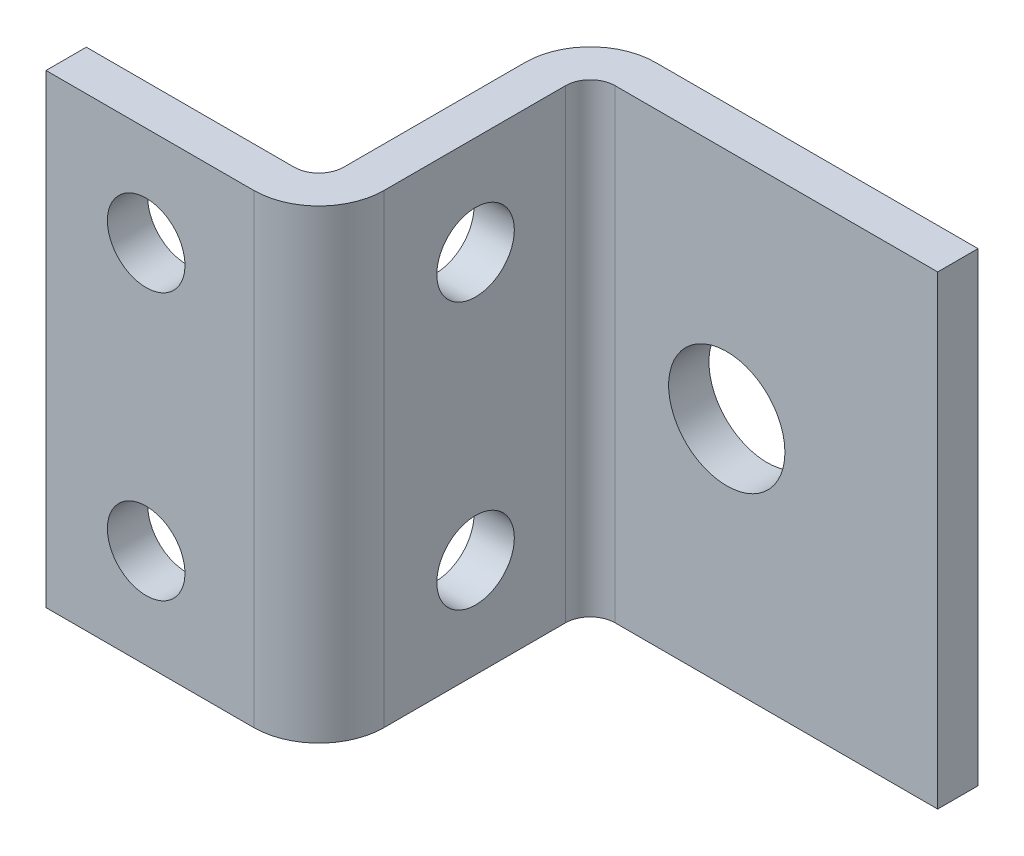
ISO-10303-21;
HEADER;
FILE_DESCRIPTION(('STEP AP214'),'2;1');
FILE_NAME('part.step','',(''),(''),'','','');
FILE_SCHEMA(('AUTOMOTIVE_DESIGN { 1 0 10303 214 1 1 1 1 }'));
ENDSEC;
DATA;
#1=APPLICATION_CONTEXT('core data for automotive mechanical design processes');
#2=APPLICATION_PROTOCOL_DEFINITION('international standard','automotive_design',2000,#1);
#3=PRODUCT_CONTEXT('',#1,'mechanical');
#4=PRODUCT('Part','Part','',(#3));
#5=PRODUCT_RELATED_PRODUCT_CATEGORY('part','',(#4));
#6=PRODUCT_DEFINITION_FORMATION('','',#4);
#7=PRODUCT_DEFINITION_CONTEXT('part definition',#1,'design');
#8=PRODUCT_DEFINITION('design','',#6,#7);
#9=PRODUCT_DEFINITION_SHAPE('','',#8);
#10=(LENGTH_UNIT() NAMED_UNIT(*) SI_UNIT(.MILLI.,.METRE.));
#11=(NAMED_UNIT(*) PLANE_ANGLE_UNIT() SI_UNIT($,.RADIAN.));
#12=(NAMED_UNIT(*) SI_UNIT($,.STERADIAN.) SOLID_ANGLE_UNIT());
#13=UNCERTAINTY_MEASURE_WITH_UNIT(LENGTH_MEASURE(1.E-05),#10,'distance_accuracy_value','');
#14=(GEOMETRIC_REPRESENTATION_CONTEXT(3) GLOBAL_UNCERTAINTY_ASSIGNED_CONTEXT((#13)) GLOBAL_UNIT_ASSIGNED_CONTEXT((#10,
#11,#12)) REPRESENTATION_CONTEXT('',''));
#15=CARTESIAN_POINT('',(0.,0.,0.));
#16=DIRECTION('',(0.,0.,1.));
#17=DIRECTION('',(1.,0.,0.));
#18=AXIS2_PLACEMENT_3D('',#15,#16,#17);
#19=CARTESIAN_POINT('',(-2.032,19.05,22.225));
#20=DIRECTION('',(0.,0.,-1.));
#21=DIRECTION('',(-1.,0.,0.));
#22=AXIS2_PLACEMENT_3D('',#19,#20,#21);
#23=PLANE('',#22);
#24=CARTESIAN_POINT('',(-10.8458,10.922,22.225));
#25=DIRECTION('',(0.,0.,-1.));
#26=DIRECTION('',(-1.,0.,0.));
#27=AXIS2_PLACEMENT_3D('',#24,#25,#26);
#28=CIRCLE('',#27,3.175);
#29=CARTESIAN_POINT('',(-14.0208,10.922,22.225));
#30=VERTEX_POINT('',#29);
#31=EDGE_CURVE('E157',#30,#30,#28,.F.);
#32=ORIENTED_EDGE('',*,*,#31,.T.);
#33=EDGE_LOOP('',(#32));
#34=FACE_BOUND('',#33,.T.);
#35=DIRECTION('',(1.,0.,0.));
#36=VECTOR('',#35,1.);
#37=CARTESIAN_POINT('',(-2.032,-19.05,22.225));
#38=LINE('',#37,#36);
#39=CARTESIAN_POINT('',(-19.05,-19.05,22.225));
#40=VERTEX_POINT('',#39);
#41=CARTESIAN_POINT('',(-2.032,-19.05,22.225));
#42=VERTEX_POINT('',#41);
#43=EDGE_CURVE('E172',#40,#42,#38,.T.);
#44=ORIENTED_EDGE('',*,*,#43,.F.);
#45=DIRECTION('',(0.,-1.,0.));
#46=VECTOR('',#45,1.);
#47=CARTESIAN_POINT('',(-19.05,19.05,22.225));
#48=LINE('',#47,#46);
#49=CARTESIAN_POINT('',(-19.05,19.05,22.225));
#50=VERTEX_POINT('',#49);
#51=EDGE_CURVE('E188',#50,#40,#48,.T.);
#52=ORIENTED_EDGE('',*,*,#51,.F.);
#53=DIRECTION('',(1.,0.,0.));
#54=VECTOR('',#53,1.);
#55=CARTESIAN_POINT('',(-2.032,19.05,22.225));
#56=LINE('',#55,#54);
#57=CARTESIAN_POINT('',(-2.032,19.05,22.225));
#58=VERTEX_POINT('',#57);
#59=EDGE_CURVE('E230',#50,#58,#56,.T.);
#60=ORIENTED_EDGE('',*,*,#59,.T.);
#61=DIRECTION('',(0.,-1.,0.));
#62=VECTOR('',#61,1.);
#63=CARTESIAN_POINT('',(-2.032,19.05,22.225));
#64=LINE('',#63,#62);
#65=EDGE_CURVE('E190',#58,#42,#64,.T.);
#66=ORIENTED_EDGE('',*,*,#65,.T.);
#67=EDGE_LOOP('',(#44,#52,#60,#66));
#68=FACE_BOUND('',#67,.T.);
#69=CARTESIAN_POINT('',(-10.8458,-10.922,22.225));
#70=DIRECTION('',(0.,0.,-1.));
#71=DIRECTION('',(-1.,0.,0.));
#72=AXIS2_PLACEMENT_3D('',#69,#70,#71);
#73=CIRCLE('',#72,3.175);
#74=CARTESIAN_POINT('',(-14.0208,-10.922,22.225));
#75=VERTEX_POINT('',#74);
#76=EDGE_CURVE('E255',#75,#75,#73,.F.);
#77=ORIENTED_EDGE('',*,*,#76,.T.);
#78=EDGE_LOOP('',(#77));
#79=FACE_BOUND('',#78,.T.);
#80=ADVANCED_FACE('F32',(#34,#68,#79),#23,.T.);
#81=CARTESIAN_POINT('',(-2.032,19.05,25.527));
#82=DIRECTION('',(0.,0.,-1.));
#83=DIRECTION('',(-1.,0.,0.));
#84=AXIS2_PLACEMENT_3D('',#81,#82,#83);
#85=PLANE('',#84);
#86=CARTESIAN_POINT('',(-10.8458,10.922,25.527));
#87=DIRECTION('',(0.,0.,-1.));
#88=DIRECTION('',(-1.,0.,0.));
#89=AXIS2_PLACEMENT_3D('',#86,#87,#88);
#90=CIRCLE('',#89,3.175);
#91=CARTESIAN_POINT('',(-14.0208,10.922,25.527));
#92=VERTEX_POINT('',#91);
#93=EDGE_CURVE('E259',#92,#92,#90,.T.);
#94=ORIENTED_EDGE('',*,*,#93,.T.);
#95=EDGE_LOOP('',(#94));
#96=FACE_BOUND('',#95,.T.);
#97=DIRECTION('',(1.,0.,0.));
#98=VECTOR('',#97,1.);
#99=CARTESIAN_POINT('',(-2.032,-19.05,25.527));
#100=LINE('',#99,#98);
#101=CARTESIAN_POINT('',(-19.05,-19.05,25.527));
#102=VERTEX_POINT('',#101);
#103=CARTESIAN_POINT('',(-2.032,-19.05,25.527));
#104=VERTEX_POINT('',#103);
#105=EDGE_CURVE('E178',#102,#104,#100,.T.);
#106=ORIENTED_EDGE('',*,*,#105,.T.);
#107=DIRECTION('',(0.,-1.,0.));
#108=VECTOR('',#107,1.);
#109=CARTESIAN_POINT('',(-2.032,19.05,25.527));
#110=LINE('',#109,#108);
#111=CARTESIAN_POINT('',(-2.032,19.05,25.527));
#112=VERTEX_POINT('',#111);
#113=EDGE_CURVE('E144',#112,#104,#110,.T.);
#114=ORIENTED_EDGE('',*,*,#113,.F.);
#115=DIRECTION('',(1.,0.,0.));
#116=VECTOR('',#115,1.);
#117=CARTESIAN_POINT('',(-2.032,19.05,25.527));
#118=LINE('',#117,#116);
#119=CARTESIAN_POINT('',(-19.05,19.05,25.527));
#120=VERTEX_POINT('',#119);
#121=EDGE_CURVE('E135',#120,#112,#118,.T.);
#122=ORIENTED_EDGE('',*,*,#121,.F.);
#123=DIRECTION('',(0.,-1.,0.));
#124=VECTOR('',#123,1.);
#125=CARTESIAN_POINT('',(-19.05,19.05,25.527));
#126=LINE('',#125,#124);
#127=EDGE_CURVE('E186',#120,#102,#126,.T.);
#128=ORIENTED_EDGE('',*,*,#127,.T.);
#129=EDGE_LOOP('',(#106,#114,#122,#128));
#130=FACE_BOUND('',#129,.T.);
#131=CARTESIAN_POINT('',(-10.8458,-10.922,25.527));
#132=DIRECTION('',(0.,0.,-1.));
#133=DIRECTION('',(-1.,0.,0.));
#134=AXIS2_PLACEMENT_3D('',#131,#132,#133);
#135=CIRCLE('',#134,3.175);
#136=CARTESIAN_POINT('',(-14.0208,-10.922,25.527));
#137=VERTEX_POINT('',#136);
#138=EDGE_CURVE('E253',#137,#137,#135,.T.);
#139=ORIENTED_EDGE('',*,*,#138,.T.);
#140=EDGE_LOOP('',(#139));
#141=FACE_BOUND('',#140,.T.);
#142=ADVANCED_FACE('F246',(#96,#130,#141),#85,.F.);
#143=CARTESIAN_POINT('',(5.334,19.05,3.302));
#144=DIRECTION('',(0.,0.,-1.));
#145=DIRECTION('',(-1.,0.,0.));
#146=AXIS2_PLACEMENT_3D('',#143,#144,#145);
#147=PLANE('',#146);
#148=CARTESIAN_POINT('',(14.478,0.,3.302));
#149=DIRECTION('',(0.,0.,1.));
#150=DIRECTION('',(1.,0.,0.));
#151=AXIS2_PLACEMENT_3D('',#148,#149,#150);
#152=CIRCLE('',#151,4.7625);
#153=CARTESIAN_POINT('',(19.2405,0.,3.302));
#154=VERTEX_POINT('',#153);
#155=EDGE_CURVE('E315',#154,#154,#152,.T.);
#156=ORIENTED_EDGE('',*,*,#155,.F.);
#157=EDGE_LOOP('',(#156));
#158=FACE_BOUND('',#157,.T.);
#159=DIRECTION('',(1.,0.,0.));
#160=VECTOR('',#159,1.);
#161=CARTESIAN_POINT('',(5.334,-19.05,3.302));
#162=LINE('',#161,#160);
#163=CARTESIAN_POINT('',(5.334,-19.05,3.302));
#164=VERTEX_POINT('',#163);
#165=CARTESIAN_POINT('',(31.75,-19.05,3.302));
#166=VERTEX_POINT('',#165);
#167=EDGE_CURVE('E153',#164,#166,#162,.T.);
#168=ORIENTED_EDGE('',*,*,#167,.T.);
#169=DIRECTION('',(0.,-1.,0.));
#170=VECTOR('',#169,1.);
#171=CARTESIAN_POINT('',(31.75,19.05,3.302));
#172=LINE('',#171,#170);
#173=CARTESIAN_POINT('',(31.75,19.05,3.302));
#174=VERTEX_POINT('',#173);
#175=EDGE_CURVE('E11',#174,#166,#172,.T.);
#176=ORIENTED_EDGE('',*,*,#175,.F.);
#177=DIRECTION('',(1.,0.,0.));
#178=VECTOR('',#177,1.);
#179=CARTESIAN_POINT('',(5.334,19.05,3.302));
#180=LINE('',#179,#178);
#181=CARTESIAN_POINT('',(5.334,19.05,3.302));
#182=VERTEX_POINT('',#181);
#183=EDGE_CURVE('E101',#182,#174,#180,.T.);
#184=ORIENTED_EDGE('',*,*,#183,.F.);
#185=DIRECTION('',(0.,-1.,0.));
#186=VECTOR('',#185,1.);
#187=CARTESIAN_POINT('',(5.334,19.05,3.302));
#188=LINE('',#187,#186);
#189=EDGE_CURVE('E149',#182,#164,#188,.T.);
#190=ORIENTED_EDGE('',*,*,#189,.T.);
#191=EDGE_LOOP('',(#168,#176,#184,#190));
#192=FACE_BOUND('',#191,.T.);
#193=ADVANCED_FACE('F34',(#158,#192),#147,.F.);
#194=CARTESIAN_POINT('',(31.75,19.05,0.));
#195=DIRECTION('',(1.,0.,0.));
#196=DIRECTION('',(0.,0.,-1.));
#197=AXIS2_PLACEMENT_3D('',#194,#195,#196);
#198=PLANE('',#197);
#199=DIRECTION('',(0.,0.,1.));
#200=VECTOR('',#199,1.);
#201=CARTESIAN_POINT('',(31.75,-19.05,0.));
#202=LINE('',#201,#200);
#203=CARTESIAN_POINT('',(31.75,-19.05,0.));
#204=VERTEX_POINT('',#203);
#205=EDGE_CURVE('E156',#204,#166,#202,.T.);
#206=ORIENTED_EDGE('',*,*,#205,.F.);
#207=DIRECTION('',(0.,-1.,0.));
#208=VECTOR('',#207,1.);
#209=CARTESIAN_POINT('',(31.75,19.05,0.));
#210=LINE('',#209,#208);
#211=CARTESIAN_POINT('',(31.75,19.05,0.));
#212=VERTEX_POINT('',#211);
#213=EDGE_CURVE('E41',#212,#204,#210,.T.);
#214=ORIENTED_EDGE('',*,*,#213,.F.);
#215=DIRECTION('',(0.,0.,1.));
#216=VECTOR('',#215,1.);
#217=CARTESIAN_POINT('',(31.75,19.05,0.));
#218=LINE('',#217,#216);
#219=EDGE_CURVE('E219',#212,#174,#218,.T.);
#220=ORIENTED_EDGE('',*,*,#219,.T.);
#221=ORIENTED_EDGE('',*,*,#175,.T.);
#222=EDGE_LOOP('',(#206,#214,#220,#221));
#223=FACE_BOUND('',#222,.T.);
#224=ADVANCED_FACE('F206',(#223),#198,.T.);
#225=CARTESIAN_POINT('',(5.334,19.05,0.));
#226=DIRECTION('',(0.,0.,-1.));
#227=DIRECTION('',(-1.,0.,0.));
#228=AXIS2_PLACEMENT_3D('',#225,#226,#227);
#229=PLANE('',#228);
#230=CARTESIAN_POINT('',(14.478,0.,0.));
#231=DIRECTION('',(0.,0.,1.));
#232=DIRECTION('',(1.,0.,0.));
#233=AXIS2_PLACEMENT_3D('',#230,#231,#232);
#234=CIRCLE('',#233,4.7625);
#235=CARTESIAN_POINT('',(19.2405,0.,0.));
#236=VERTEX_POINT('',#235);
#237=EDGE_CURVE('E450',#236,#236,#234,.T.);
#238=ORIENTED_EDGE('',*,*,#237,.T.);
#239=EDGE_LOOP('',(#238));
#240=FACE_BOUND('',#239,.T.);
#241=DIRECTION('',(1.,0.,0.));
#242=VECTOR('',#241,1.);
#243=CARTESIAN_POINT('',(5.334,-19.05,0.));
#244=LINE('',#243,#242);
#245=CARTESIAN_POINT('',(5.334,-19.05,0.));
#246=VERTEX_POINT('',#245);
#247=EDGE_CURVE('E160',#246,#204,#244,.T.);
#248=ORIENTED_EDGE('',*,*,#247,.F.);
#249=DIRECTION('',(0.,-1.,0.));
#250=VECTOR('',#249,1.);
#251=CARTESIAN_POINT('',(5.334,19.05,0.));
#252=LINE('',#251,#250);
#253=CARTESIAN_POINT('',(5.334,19.05,0.));
#254=VERTEX_POINT('',#253);
#255=EDGE_CURVE('E196',#254,#246,#252,.T.);
#256=ORIENTED_EDGE('',*,*,#255,.F.);
#257=DIRECTION('',(1.,0.,0.));
#258=VECTOR('',#257,1.);
#259=CARTESIAN_POINT('',(5.334,19.05,0.));
#260=LINE('',#259,#258);
#261=EDGE_CURVE('E203',#254,#212,#260,.T.);
#262=ORIENTED_EDGE('',*,*,#261,.T.);
#263=ORIENTED_EDGE('',*,*,#213,.T.);
#264=EDGE_LOOP('',(#248,#256,#262,#263));
#265=FACE_BOUND('',#264,.T.);
#266=ADVANCED_FACE('F201',(#240,#265),#229,.T.);
#267=CARTESIAN_POINT('',(5.334,19.05,5.334));
#268=DIRECTION('',(0.,-1.,0.));
#269=DIRECTION('',(0.,0.,-1.));
#270=AXIS2_PLACEMENT_3D('',#267,#268,#269);
#271=CYLINDRICAL_SURFACE('',#270,5.334);
#272=CARTESIAN_POINT('',(5.334,-19.05,5.334));
#273=DIRECTION('',(0.,-1.,0.));
#274=DIRECTION('',(0.,0.,-1.));
#275=AXIS2_PLACEMENT_3D('',#272,#273,#274);
#276=CIRCLE('',#275,5.334);
#277=CARTESIAN_POINT('',(0.,-19.05,5.334));
#278=VERTEX_POINT('',#277);
#279=EDGE_CURVE('E163',#278,#246,#276,.T.);
#280=ORIENTED_EDGE('',*,*,#279,.F.);
#281=DIRECTION('',(0.,-1.,0.));
#282=VECTOR('',#281,1.);
#283=CARTESIAN_POINT('',(0.,19.05,5.334));
#284=LINE('',#283,#282);
#285=CARTESIAN_POINT('',(0.,19.05,5.334));
#286=VERTEX_POINT('',#285);
#287=EDGE_CURVE('E194',#286,#278,#284,.T.);
#288=ORIENTED_EDGE('',*,*,#287,.F.);
#289=CARTESIAN_POINT('',(5.334,19.05,5.334));
#290=DIRECTION('',(0.,-1.,0.));
#291=DIRECTION('',(0.,0.,-1.));
#292=AXIS2_PLACEMENT_3D('',#289,#290,#291);
#293=CIRCLE('',#292,5.334);
#294=EDGE_CURVE('E216',#286,#254,#293,.T.);
#295=ORIENTED_EDGE('',*,*,#294,.T.);
#296=ORIENTED_EDGE('',*,*,#255,.T.);
#297=EDGE_LOOP('',(#280,#288,#295,#296));
#298=FACE_BOUND('',#297,.T.);
#299=ADVANCED_FACE('F213',(#298),#271,.T.);
#300=CARTESIAN_POINT('',(0.,19.05,20.193));
#301=DIRECTION('',(-1.,0.,0.));
#302=DIRECTION('',(0.,0.,1.));
#303=AXIS2_PLACEMENT_3D('',#300,#301,#302);
#304=PLANE('',#303);
#305=CARTESIAN_POINT('',(0.,-10.922,12.7));
#306=DIRECTION('',(-1.,0.,0.));
#307=DIRECTION('',(0.,0.,1.));
#308=AXIS2_PLACEMENT_3D('',#305,#306,#307);
#309=CIRCLE('',#308,3.175);
#310=CARTESIAN_POINT('',(0.,-10.922,15.875));
#311=VERTEX_POINT('',#310);
#312=EDGE_CURVE('E443',#311,#311,#309,.T.);
#313=ORIENTED_EDGE('',*,*,#312,.F.);
#314=EDGE_LOOP('',(#313));
#315=FACE_BOUND('',#314,.T.);
#316=CARTESIAN_POINT('',(0.,10.922,12.7));
#317=DIRECTION('',(-1.,0.,0.));
#318=DIRECTION('',(0.,0.,1.));
#319=AXIS2_PLACEMENT_3D('',#316,#317,#318);
#320=CIRCLE('',#319,3.175);
#321=CARTESIAN_POINT('',(0.,10.922,15.875));
#322=VERTEX_POINT('',#321);
#323=EDGE_CURVE('E256',#322,#322,#320,.T.);
#324=ORIENTED_EDGE('',*,*,#323,.F.);
#325=EDGE_LOOP('',(#324));
#326=FACE_BOUND('',#325,.T.);
#327=DIRECTION('',(0.,0.,-1.));
#328=VECTOR('',#327,1.);
#329=CARTESIAN_POINT('',(0.,-19.05,20.193));
#330=LINE('',#329,#328);
#331=CARTESIAN_POINT('',(0.,-19.05,20.193));
#332=VERTEX_POINT('',#331);
#333=EDGE_CURVE('E166',#332,#278,#330,.T.);
#334=ORIENTED_EDGE('',*,*,#333,.F.);
#335=DIRECTION('',(0.,-1.,0.));
#336=VECTOR('',#335,1.);
#337=CARTESIAN_POINT('',(0.,19.05,20.193));
#338=LINE('',#337,#336);
#339=CARTESIAN_POINT('',(0.,19.05,20.193));
#340=VERTEX_POINT('',#339);
#341=EDGE_CURVE('E192',#340,#332,#338,.T.);
#342=ORIENTED_EDGE('',*,*,#341,.F.);
#343=DIRECTION('',(0.,0.,-1.));
#344=VECTOR('',#343,1.);
#345=CARTESIAN_POINT('',(0.,19.05,20.193));
#346=LINE('',#345,#344);
#347=EDGE_CURVE('E221',#340,#286,#346,.T.);
#348=ORIENTED_EDGE('',*,*,#347,.T.);
#349=ORIENTED_EDGE('',*,*,#287,.T.);
#350=EDGE_LOOP('',(#334,#342,#348,#349));
#351=FACE_BOUND('',#350,.T.);
#352=ADVANCED_FACE('F296',(#315,#326,#351),#304,.T.);
#353=CARTESIAN_POINT('',(-2.032,19.05,20.193));
#354=DIRECTION('',(0.,-1.,0.));
#355=DIRECTION('',(0.,0.,-1.));
#356=AXIS2_PLACEMENT_3D('',#353,#354,#355);
#357=CYLINDRICAL_SURFACE('',#356,2.032);
#358=CARTESIAN_POINT('',(-2.032,-19.05,20.193));
#359=DIRECTION('',(0.,1.,0.));
#360=DIRECTION('',(0.,0.,-1.));
#361=AXIS2_PLACEMENT_3D('',#358,#359,#360);
#362=CIRCLE('',#361,2.032);
#363=EDGE_CURVE('E169',#42,#332,#362,.T.);
#364=ORIENTED_EDGE('',*,*,#363,.F.);
#365=ORIENTED_EDGE('',*,*,#65,.F.);
#366=CARTESIAN_POINT('',(-2.032,19.05,20.193));
#367=DIRECTION('',(0.,1.,0.));
#368=DIRECTION('',(0.,0.,-1.));
#369=AXIS2_PLACEMENT_3D('',#366,#367,#368);
#370=CIRCLE('',#369,2.032);
#371=EDGE_CURVE('E227',#58,#340,#370,.T.);
#372=ORIENTED_EDGE('',*,*,#371,.T.);
#373=ORIENTED_EDGE('',*,*,#341,.T.);
#374=EDGE_LOOP('',(#364,#365,#372,#373));
#375=FACE_BOUND('',#374,.T.);
#376=ADVANCED_FACE('F293',(#375),#357,.F.);
#377=CARTESIAN_POINT('',(-19.05,19.05,25.527));
#378=DIRECTION('',(-1.,0.,0.));
#379=DIRECTION('',(0.,0.,1.));
#380=AXIS2_PLACEMENT_3D('',#377,#378,#379);
#381=PLANE('',#380);
#382=DIRECTION('',(0.,0.,-1.));
#383=VECTOR('',#382,1.);
#384=CARTESIAN_POINT('',(-19.05,-19.05,25.527));
#385=LINE('',#384,#383);
#386=EDGE_CURVE('E175',#102,#40,#385,.T.);
#387=ORIENTED_EDGE('',*,*,#386,.F.);
#388=ORIENTED_EDGE('',*,*,#127,.F.);
#389=DIRECTION('',(0.,0.,-1.));
#390=VECTOR('',#389,1.);
#391=CARTESIAN_POINT('',(-19.05,19.05,25.527));
#392=LINE('',#391,#390);
#393=EDGE_CURVE('E233',#120,#50,#392,.T.);
#394=ORIENTED_EDGE('',*,*,#393,.T.);
#395=ORIENTED_EDGE('',*,*,#51,.T.);
#396=EDGE_LOOP('',(#387,#388,#394,#395));
#397=FACE_BOUND('',#396,.T.);
#398=ADVANCED_FACE('F237',(#397),#381,.T.);
#399=CARTESIAN_POINT('',(-2.032,19.05,20.193));
#400=DIRECTION('',(0.,-1.,0.));
#401=DIRECTION('',(0.,0.,-1.));
#402=AXIS2_PLACEMENT_3D('',#399,#400,#401);
#403=CYLINDRICAL_SURFACE('',#402,5.334);
#404=CARTESIAN_POINT('',(-2.032,-19.05,20.193));
#405=DIRECTION('',(0.,1.,0.));
#406=DIRECTION('',(1.,0.,0.));
#407=AXIS2_PLACEMENT_3D('',#404,#405,#406);
#408=CIRCLE('',#407,5.334);
#409=CARTESIAN_POINT('',(3.302,-19.05,20.193));
#410=VERTEX_POINT('',#409);
#411=EDGE_CURVE('E143',#104,#410,#408,.T.);
#412=ORIENTED_EDGE('',*,*,#411,.T.);
#413=DIRECTION('',(0.,-1.,0.));
#414=VECTOR('',#413,1.);
#415=CARTESIAN_POINT('',(3.302,19.05,20.193));
#416=LINE('',#415,#414);
#417=CARTESIAN_POINT('',(3.302,19.05,20.193));
#418=VERTEX_POINT('',#417);
#419=EDGE_CURVE('E140',#418,#410,#416,.T.);
#420=ORIENTED_EDGE('',*,*,#419,.F.);
#421=CARTESIAN_POINT('',(-2.032,19.05,20.193));
#422=DIRECTION('',(0.,1.,0.));
#423=DIRECTION('',(1.,0.,0.));
#424=AXIS2_PLACEMENT_3D('',#421,#422,#423);
#425=CIRCLE('',#424,5.334);
#426=EDGE_CURVE('E128',#112,#418,#425,.T.);
#427=ORIENTED_EDGE('',*,*,#426,.F.);
#428=ORIENTED_EDGE('',*,*,#113,.T.);
#429=EDGE_LOOP('',(#412,#420,#427,#428));
#430=FACE_BOUND('',#429,.T.);
#431=ADVANCED_FACE('F141',(#430),#403,.T.);
#432=CARTESIAN_POINT('',(3.302,19.05,20.193));
#433=DIRECTION('',(-1.,0.,0.));
#434=DIRECTION('',(0.,0.,1.));
#435=AXIS2_PLACEMENT_3D('',#432,#433,#434);
#436=PLANE('',#435);
#437=CARTESIAN_POINT('',(3.302,-10.922,12.7));
#438=DIRECTION('',(1.,0.,0.));
#439=DIRECTION('',(0.,0.,-1.));
#440=AXIS2_PLACEMENT_3D('',#437,#438,#439);
#441=CIRCLE('',#440,3.175);
#442=CARTESIAN_POINT('',(3.302,-10.922,9.525));
#443=VERTEX_POINT('',#442);
#444=EDGE_CURVE('E445',#443,#443,#441,.T.);
#445=ORIENTED_EDGE('',*,*,#444,.F.);
#446=EDGE_LOOP('',(#445));
#447=FACE_BOUND('',#446,.T.);
#448=CARTESIAN_POINT('',(3.302,10.922,12.7));
#449=DIRECTION('',(1.,0.,0.));
#450=DIRECTION('',(0.,0.,-1.));
#451=AXIS2_PLACEMENT_3D('',#448,#449,#450);
#452=CIRCLE('',#451,3.175);
#453=CARTESIAN_POINT('',(3.302,10.922,9.525));
#454=VERTEX_POINT('',#453);
#455=EDGE_CURVE('E262',#454,#454,#452,.T.);
#456=ORIENTED_EDGE('',*,*,#455,.F.);
#457=EDGE_LOOP('',(#456));
#458=FACE_BOUND('',#457,.T.);
#459=DIRECTION('',(0.,0.,-1.));
#460=VECTOR('',#459,1.);
#461=CARTESIAN_POINT('',(3.302,-19.05,20.193));
#462=LINE('',#461,#460);
#463=CARTESIAN_POINT('',(3.302,-19.05,5.334));
#464=VERTEX_POINT('',#463);
#465=EDGE_CURVE('E89',#410,#464,#462,.T.);
#466=ORIENTED_EDGE('',*,*,#465,.T.);
#467=DIRECTION('',(0.,-1.,0.));
#468=VECTOR('',#467,1.);
#469=CARTESIAN_POINT('',(3.302,19.05,5.334));
#470=LINE('',#469,#468);
#471=CARTESIAN_POINT('',(3.302,19.05,5.334));
#472=VERTEX_POINT('',#471);
#473=EDGE_CURVE('E145',#472,#464,#470,.T.);
#474=ORIENTED_EDGE('',*,*,#473,.F.);
#475=DIRECTION('',(0.,0.,-1.));
#476=VECTOR('',#475,1.);
#477=CARTESIAN_POINT('',(3.302,19.05,20.193));
#478=LINE('',#477,#476);
#479=EDGE_CURVE('E132',#418,#472,#478,.T.);
#480=ORIENTED_EDGE('',*,*,#479,.F.);
#481=ORIENTED_EDGE('',*,*,#419,.T.);
#482=EDGE_LOOP('',(#466,#474,#480,#481));
#483=FACE_BOUND('',#482,.T.);
#484=ADVANCED_FACE('F147',(#447,#458,#483),#436,.F.);
#485=CARTESIAN_POINT('',(5.334,19.05,5.334));
#486=DIRECTION('',(0.,-1.,0.));
#487=DIRECTION('',(0.,0.,-1.));
#488=AXIS2_PLACEMENT_3D('',#485,#486,#487);
#489=CYLINDRICAL_SURFACE('',#488,2.032);
#490=CARTESIAN_POINT('',(5.334,-19.05,5.334));
#491=DIRECTION('',(0.,1.,0.));
#492=DIRECTION('',(1.,0.,0.));
#493=AXIS2_PLACEMENT_3D('',#490,#491,#492);
#494=CIRCLE('',#493,2.032);
#495=EDGE_CURVE('E95',#464,#164,#494,.F.);
#496=ORIENTED_EDGE('',*,*,#495,.T.);
#497=ORIENTED_EDGE('',*,*,#189,.F.);
#498=CARTESIAN_POINT('',(5.334,19.05,5.334));
#499=DIRECTION('',(0.,1.,0.));
#500=DIRECTION('',(1.,0.,0.));
#501=AXIS2_PLACEMENT_3D('',#498,#499,#500);
#502=CIRCLE('',#501,2.032);
#503=EDGE_CURVE('E49',#472,#182,#502,.F.);
#504=ORIENTED_EDGE('',*,*,#503,.F.);
#505=ORIENTED_EDGE('',*,*,#473,.T.);
#506=EDGE_LOOP('',(#496,#497,#504,#505));
#507=FACE_BOUND('',#506,.T.);
#508=ADVANCED_FACE('F316',(#507),#489,.F.);
#509=CARTESIAN_POINT('',(5.334,19.05,5.334));
#510=DIRECTION('',(0.,-1.,0.));
#511=DIRECTION('',(-1.,0.,0.));
#512=AXIS2_PLACEMENT_3D('',#509,#510,#511);
#513=PLANE('',#512);
#514=ORIENTED_EDGE('',*,*,#183,.T.);
#515=ORIENTED_EDGE('',*,*,#219,.F.);
#516=ORIENTED_EDGE('',*,*,#261,.F.);
#517=ORIENTED_EDGE('',*,*,#294,.F.);
#518=ORIENTED_EDGE('',*,*,#347,.F.);
#519=ORIENTED_EDGE('',*,*,#371,.F.);
#520=ORIENTED_EDGE('',*,*,#59,.F.);
#521=ORIENTED_EDGE('',*,*,#393,.F.);
#522=ORIENTED_EDGE('',*,*,#121,.T.);
#523=ORIENTED_EDGE('',*,*,#426,.T.);
#524=ORIENTED_EDGE('',*,*,#479,.T.);
#525=ORIENTED_EDGE('',*,*,#503,.T.);
#526=EDGE_LOOP('',(#514,#515,#516,#517,#518,#519,#520,#521,#522,#523,#524,#525));
#527=FACE_BOUND('',#526,.T.);
#528=ADVANCED_FACE('F130',(#527),#513,.F.);
#529=CARTESIAN_POINT('',(5.334,-19.05,5.334));
#530=DIRECTION('',(0.,-1.,0.));
#531=DIRECTION('',(-1.,0.,0.));
#532=AXIS2_PLACEMENT_3D('',#529,#530,#531);
#533=PLANE('',#532);
#534=ORIENTED_EDGE('',*,*,#167,.F.);
#535=ORIENTED_EDGE('',*,*,#495,.F.);
#536=ORIENTED_EDGE('',*,*,#465,.F.);
#537=ORIENTED_EDGE('',*,*,#411,.F.);
#538=ORIENTED_EDGE('',*,*,#105,.F.);
#539=ORIENTED_EDGE('',*,*,#386,.T.);
#540=ORIENTED_EDGE('',*,*,#43,.T.);
#541=ORIENTED_EDGE('',*,*,#363,.T.);
#542=ORIENTED_EDGE('',*,*,#333,.T.);
#543=ORIENTED_EDGE('',*,*,#279,.T.);
#544=ORIENTED_EDGE('',*,*,#247,.T.);
#545=ORIENTED_EDGE('',*,*,#205,.T.);
#546=EDGE_LOOP('',(#534,#535,#536,#537,#538,#539,#540,#541,#542,#543,#544,#545));
#547=FACE_BOUND('',#546,.T.);
#548=ADVANCED_FACE('F209',(#547),#533,.T.);
#549=CARTESIAN_POINT('',(-10.8458,10.922,0.));
#550=DIRECTION('',(0.,0.,1.));
#551=DIRECTION('',(1.,0.,0.));
#552=AXIS2_PLACEMENT_3D('',#549,#550,#551);
#553=CYLINDRICAL_SURFACE('',#552,3.175);
#554=ORIENTED_EDGE('',*,*,#31,.F.);
#555=EDGE_LOOP('',(#554));
#556=FACE_BOUND('',#555,.T.);
#557=ORIENTED_EDGE('',*,*,#93,.F.);
#558=EDGE_LOOP('',(#557));
#559=FACE_BOUND('',#558,.T.);
#560=ADVANCED_FACE('F272',(#556,#559),#553,.F.);
#561=CARTESIAN_POINT('',(-10.8458,-10.922,0.));
#562=DIRECTION('',(0.,0.,1.));
#563=DIRECTION('',(1.,0.,0.));
#564=AXIS2_PLACEMENT_3D('',#561,#562,#563);
#565=CYLINDRICAL_SURFACE('',#564,3.175);
#566=ORIENTED_EDGE('',*,*,#76,.F.);
#567=EDGE_LOOP('',(#566));
#568=FACE_BOUND('',#567,.T.);
#569=ORIENTED_EDGE('',*,*,#138,.F.);
#570=EDGE_LOOP('',(#569));
#571=FACE_BOUND('',#570,.T.);
#572=ADVANCED_FACE('F275',(#568,#571),#565,.F.);
#573=CARTESIAN_POINT('',(-19.05,10.922,12.7));
#574=DIRECTION('',(1.,0.,0.));
#575=DIRECTION('',(0.,0.,-1.));
#576=AXIS2_PLACEMENT_3D('',#573,#574,#575);
#577=CYLINDRICAL_SURFACE('',#576,3.175);
#578=ORIENTED_EDGE('',*,*,#323,.T.);
#579=EDGE_LOOP('',(#578));
#580=FACE_BOUND('',#579,.T.);
#581=ORIENTED_EDGE('',*,*,#455,.T.);
#582=EDGE_LOOP('',(#581));
#583=FACE_BOUND('',#582,.T.);
#584=ADVANCED_FACE('F282',(#580,#583),#577,.F.);
#585=CARTESIAN_POINT('',(-19.05,-10.922,12.7));
#586=DIRECTION('',(1.,0.,0.));
#587=DIRECTION('',(0.,0.,-1.));
#588=AXIS2_PLACEMENT_3D('',#585,#586,#587);
#589=CYLINDRICAL_SURFACE('',#588,3.175);
#590=ORIENTED_EDGE('',*,*,#312,.T.);
#591=EDGE_LOOP('',(#590));
#592=FACE_BOUND('',#591,.T.);
#593=ORIENTED_EDGE('',*,*,#444,.T.);
#594=EDGE_LOOP('',(#593));
#595=FACE_BOUND('',#594,.T.);
#596=ADVANCED_FACE('F363',(#592,#595),#589,.F.);
#597=CARTESIAN_POINT('',(14.478,0.,0.));
#598=DIRECTION('',(0.,0.,1.));
#599=DIRECTION('',(1.,0.,0.));
#600=AXIS2_PLACEMENT_3D('',#597,#598,#599);
#601=CYLINDRICAL_SURFACE('',#600,4.7625);
#602=ORIENTED_EDGE('',*,*,#237,.F.);
#603=EDGE_LOOP('',(#602));
#604=FACE_BOUND('',#603,.T.);
#605=ORIENTED_EDGE('',*,*,#155,.T.);
#606=EDGE_LOOP('',(#605));
#607=FACE_BOUND('',#606,.T.);
#608=ADVANCED_FACE('F359',(#604,#607),#601,.F.);
#609=CLOSED_SHELL('',(#80,#142,#193,#224,#266,#299,#352,#376,#398,#431,#484,#508,#528,#548,#560,
#572,#584,#596,#608));
#610=MANIFOLD_SOLID_BREP('B2',#609);
#611=ADVANCED_BREP_SHAPE_REPRESENTATION('',(#18,#610),#14);
#612=SHAPE_DEFINITION_REPRESENTATION(#9,#611);
ENDSEC;
END-ISO-10303-21;
